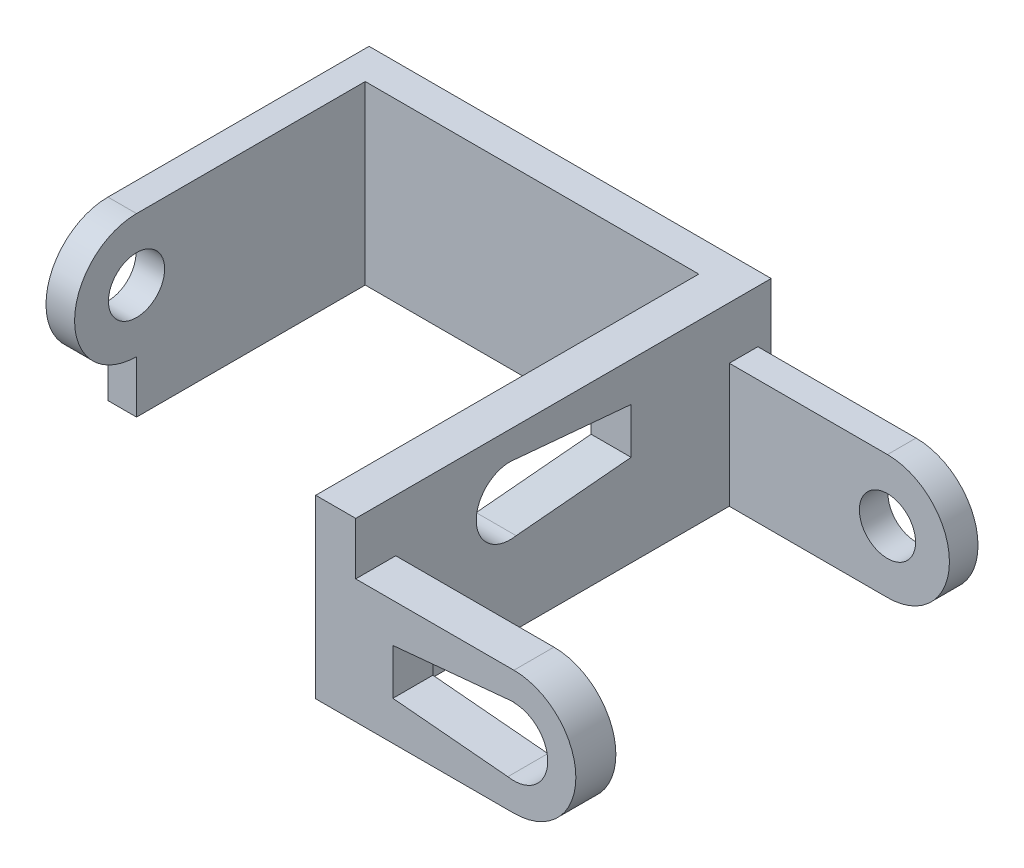
ISO-10303-21;
HEADER;
FILE_DESCRIPTION(('STEP AP214'),'2;1');
FILE_NAME('part.step','',(''),(''),'','','');
FILE_SCHEMA(('AUTOMOTIVE_DESIGN { 1 0 10303 214 1 1 1 1 }'));
ENDSEC;
DATA;
#1=APPLICATION_CONTEXT('core data for automotive mechanical design processes');
#2=APPLICATION_PROTOCOL_DEFINITION('international standard','automotive_design',2000,#1);
#3=PRODUCT_CONTEXT('',#1,'mechanical');
#4=PRODUCT('Part','Part','',(#3));
#5=PRODUCT_RELATED_PRODUCT_CATEGORY('part','',(#4));
#6=PRODUCT_DEFINITION_FORMATION('','',#4);
#7=PRODUCT_DEFINITION_CONTEXT('part definition',#1,'design');
#8=PRODUCT_DEFINITION('design','',#6,#7);
#9=PRODUCT_DEFINITION_SHAPE('','',#8);
#10=(LENGTH_UNIT() NAMED_UNIT(*) SI_UNIT(.MILLI.,.METRE.));
#11=(NAMED_UNIT(*) PLANE_ANGLE_UNIT() SI_UNIT($,.RADIAN.));
#12=(NAMED_UNIT(*) SI_UNIT($,.STERADIAN.) SOLID_ANGLE_UNIT());
#13=UNCERTAINTY_MEASURE_WITH_UNIT(LENGTH_MEASURE(1.E-05),#10,'distance_accuracy_value','');
#14=(GEOMETRIC_REPRESENTATION_CONTEXT(3) GLOBAL_UNCERTAINTY_ASSIGNED_CONTEXT((#13)) GLOBAL_UNIT_ASSIGNED_CONTEXT((#10,
#11,#12)) REPRESENTATION_CONTEXT('',''));
#15=CARTESIAN_POINT('',(0.,0.,0.));
#16=DIRECTION('',(0.,0.,1.));
#17=DIRECTION('',(1.,0.,0.));
#18=AXIS2_PLACEMENT_3D('',#15,#16,#17);
#19=CARTESIAN_POINT('',(-72.,12.,0.));
#20=DIRECTION('',(0.,0.,-1.));
#21=DIRECTION('',(-1.,0.,0.));
#22=AXIS2_PLACEMENT_3D('',#19,#20,#21);
#23=PLANE('',#22);
#24=DIRECTION('',(-1.,0.,0.));
#25=VECTOR('',#24,1.);
#26=CARTESIAN_POINT('',(-72.,17.5,0.));
#27=LINE('',#26,#25);
#28=CARTESIAN_POINT('',(-75.,17.5,0.));
#29=VERTEX_POINT('',#28);
#30=CARTESIAN_POINT('',(-72.,17.5,0.));
#31=VERTEX_POINT('',#30);
#32=EDGE_CURVE('E11',#29,#31,#27,.F.);
#33=ORIENTED_EDGE('',*,*,#32,.F.);
#34=DIRECTION('',(0.,-1.,0.));
#35=VECTOR('',#34,1.);
#36=CARTESIAN_POINT('',(-75.,12.,0.));
#37=LINE('',#36,#35);
#38=CARTESIAN_POINT('',(-75.,12.,0.));
#39=VERTEX_POINT('',#38);
#40=EDGE_CURVE('E206',#29,#39,#37,.T.);
#41=ORIENTED_EDGE('',*,*,#40,.T.);
#42=DIRECTION('',(-1.,0.,0.));
#43=VECTOR('',#42,1.);
#44=CARTESIAN_POINT('',(-72.,12.,0.));
#45=LINE('',#44,#43);
#46=CARTESIAN_POINT('',(-72.,12.,0.));
#47=VERTEX_POINT('',#46);
#48=EDGE_CURVE('E247',#47,#39,#45,.T.);
#49=ORIENTED_EDGE('',*,*,#48,.F.);
#50=DIRECTION('',(0.,-1.,0.));
#51=VECTOR('',#50,1.);
#52=CARTESIAN_POINT('',(-72.,12.,0.));
#53=LINE('',#52,#51);
#54=EDGE_CURVE('E55',#31,#47,#53,.T.);
#55=ORIENTED_EDGE('',*,*,#54,.F.);
#56=EDGE_LOOP('',(#33,#41,#49,#55));
#57=FACE_BOUND('',#56,.T.);
#58=ADVANCED_FACE('F39',(#57),#23,.F.);
#59=CARTESIAN_POINT('',(0.,0.,-24.));
#60=DIRECTION('',(0.,0.,-1.));
#61=DIRECTION('',(-1.,0.,0.));
#62=AXIS2_PLACEMENT_3D('',#59,#60,#61);
#63=PLANE('',#62);
#64=DIRECTION('',(0.,1.,0.));
#65=VECTOR('',#64,1.);
#66=CARTESIAN_POINT('',(-72.,0.,-24.));
#67=LINE('',#66,#65);
#68=CARTESIAN_POINT('',(-72.,12.,-24.));
#69=VERTEX_POINT('',#68);
#70=CARTESIAN_POINT('',(-72.,30.5,-24.));
#71=VERTEX_POINT('',#70);
#72=EDGE_CURVE('E48',#69,#71,#67,.T.);
#73=ORIENTED_EDGE('',*,*,#72,.F.);
#74=DIRECTION('',(1.,0.,0.));
#75=VECTOR('',#74,1.);
#76=CARTESIAN_POINT('',(-75.,12.,-24.));
#77=LINE('',#76,#75);
#78=CARTESIAN_POINT('',(-37.,12.,-24.));
#79=VERTEX_POINT('',#78);
#80=EDGE_CURVE('E251',#69,#79,#77,.T.);
#81=ORIENTED_EDGE('',*,*,#80,.T.);
#82=DIRECTION('',(0.,-1.,0.));
#83=VECTOR('',#82,1.);
#84=CARTESIAN_POINT('',(-37.,0.,-24.));
#85=LINE('',#84,#83);
#86=CARTESIAN_POINT('',(-37.,30.5,-24.));
#87=VERTEX_POINT('',#86);
#88=EDGE_CURVE('E482',#87,#79,#85,.T.);
#89=ORIENTED_EDGE('',*,*,#88,.F.);
#90=DIRECTION('',(-1.,0.,0.));
#91=VECTOR('',#90,1.);
#92=CARTESIAN_POINT('',(-75.,30.5,-24.));
#93=LINE('',#92,#91);
#94=EDGE_CURVE('E254',#87,#71,#93,.T.);
#95=ORIENTED_EDGE('',*,*,#94,.T.);
#96=EDGE_LOOP('',(#73,#81,#89,#95));
#97=FACE_BOUND('',#96,.T.);
#98=ADVANCED_FACE('F497',(#97),#63,.F.);
#99=CARTESIAN_POINT('',(-37.,0.,0.));
#100=DIRECTION('',(-1.,0.,0.));
#101=DIRECTION('',(0.,0.,1.));
#102=AXIS2_PLACEMENT_3D('',#99,#100,#101);
#103=PLANE('',#102);
#104=DIRECTION('',(0.,0.0899269689956985,0.995948362239352));
#105=VECTOR('',#104,1.);
#106=CARTESIAN_POINT('',(-37.,26.4032814053959,-12.7));
#107=LINE('',#106,#105);
#108=CARTESIAN_POINT('',(-37.,26.4032814053959,-12.7));
#109=VERTEX_POINT('',#108);
#110=CARTESIAN_POINT('',(-37.,27.4925832957555,-0.635894584196137));
#111=VERTEX_POINT('',#110);
#112=EDGE_CURVE('E402',#109,#111,#107,.T.);
#113=ORIENTED_EDGE('',*,*,#112,.T.);
#114=CARTESIAN_POINT('',(-37.,24.,0.));
#115=DIRECTION('',(1.,0.,0.));
#116=DIRECTION('',(0.,0.,-1.));
#117=AXIS2_PLACEMENT_3D('',#114,#115,#116);
#118=CIRCLE('',#117,3.55);
#119=CARTESIAN_POINT('',(-37.,20.5074167042445,-0.635894584196137));
#120=VERTEX_POINT('',#119);
#121=EDGE_CURVE('E422',#111,#120,#118,.T.);
#122=ORIENTED_EDGE('',*,*,#121,.T.);
#123=DIRECTION('',(0.,0.0899269689956985,-0.995948362239352));
#124=VECTOR('',#123,1.);
#125=CARTESIAN_POINT('',(-37.,20.45,0.));
#126=LINE('',#125,#124);
#127=CARTESIAN_POINT('',(-37.,21.5967185946041,-12.7));
#128=VERTEX_POINT('',#127);
#129=EDGE_CURVE('E393',#120,#128,#126,.T.);
#130=ORIENTED_EDGE('',*,*,#129,.T.);
#131=DIRECTION('',(0.,1.,0.));
#132=VECTOR('',#131,1.);
#133=CARTESIAN_POINT('',(-37.,21.5967185946041,-12.7));
#134=LINE('',#133,#132);
#135=EDGE_CURVE('E397',#128,#109,#134,.T.);
#136=ORIENTED_EDGE('',*,*,#135,.T.);
#137=EDGE_LOOP('',(#113,#122,#130,#136));
#138=FACE_BOUND('',#137,.T.);
#139=DIRECTION('',(0.,0.,1.));
#140=VECTOR('',#139,1.);
#141=CARTESIAN_POINT('',(-37.,30.5,16.2));
#142=LINE('',#141,#140);
#143=CARTESIAN_POINT('',(-37.,30.5,16.2));
#144=VERTEX_POINT('',#143);
#145=EDGE_CURVE('E433',#87,#144,#142,.T.);
#146=ORIENTED_EDGE('',*,*,#145,.F.);
#147=ORIENTED_EDGE('',*,*,#88,.T.);
#148=DIRECTION('',(0.,0.,-1.));
#149=VECTOR('',#148,1.);
#150=CARTESIAN_POINT('',(-37.,12.,16.2));
#151=LINE('',#150,#149);
#152=CARTESIAN_POINT('',(-37.,12.,16.2));
#153=VERTEX_POINT('',#152);
#154=EDGE_CURVE('E447',#153,#79,#151,.T.);
#155=ORIENTED_EDGE('',*,*,#154,.F.);
#156=DIRECTION('',(0.,-1.,0.));
#157=VECTOR('',#156,1.);
#158=CARTESIAN_POINT('',(-37.,12.,16.2));
#159=LINE('',#158,#157);
#160=EDGE_CURVE('E425',#144,#153,#159,.T.);
#161=ORIENTED_EDGE('',*,*,#160,.F.);
#162=EDGE_LOOP('',(#146,#147,#155,#161));
#163=FACE_BOUND('',#162,.T.);
#164=ADVANCED_FACE('F499',(#138,#163),#103,.T.);
#165=CARTESIAN_POINT('',(-32.8,0.,0.));
#166=DIRECTION('',(-1.,0.,0.));
#167=DIRECTION('',(0.,0.,1.));
#168=AXIS2_PLACEMENT_3D('',#165,#166,#167);
#169=PLANE('',#168);
#170=DIRECTION('',(0.,0.,1.));
#171=VECTOR('',#170,1.);
#172=CARTESIAN_POINT('',(-32.8,30.5,16.2));
#173=LINE('',#172,#171);
#174=CARTESIAN_POINT('',(-32.8,30.5,-27.4));
#175=VERTEX_POINT('',#174);
#176=CARTESIAN_POINT('',(-32.8,30.5,16.2));
#177=VERTEX_POINT('',#176);
#178=EDGE_CURVE('E441',#175,#177,#173,.T.);
#179=ORIENTED_EDGE('',*,*,#178,.T.);
#180=DIRECTION('',(0.,-1.,0.));
#181=VECTOR('',#180,1.);
#182=CARTESIAN_POINT('',(-32.8,12.,16.2));
#183=LINE('',#182,#181);
#184=CARTESIAN_POINT('',(-32.8,25.,16.2));
#185=VERTEX_POINT('',#184);
#186=EDGE_CURVE('E428',#177,#185,#183,.T.);
#187=ORIENTED_EDGE('',*,*,#186,.T.);
#188=DIRECTION('',(0.,0.,1.));
#189=VECTOR('',#188,1.);
#190=CARTESIAN_POINT('',(-32.8,25.,0.));
#191=LINE('',#190,#189);
#192=CARTESIAN_POINT('',(-32.8,25.,12.));
#193=VERTEX_POINT('',#192);
#194=EDGE_CURVE('E389',#193,#185,#191,.T.);
#195=ORIENTED_EDGE('',*,*,#194,.F.);
#196=DIRECTION('',(0.,-1.,0.));
#197=VECTOR('',#196,1.);
#198=CARTESIAN_POINT('',(-32.8,0.,12.));
#199=LINE('',#198,#197);
#200=CARTESIAN_POINT('',(-32.8,12.,12.));
#201=VERTEX_POINT('',#200);
#202=EDGE_CURVE('E385',#193,#201,#199,.T.);
#203=ORIENTED_EDGE('',*,*,#202,.T.);
#204=DIRECTION('',(0.,0.,-1.));
#205=VECTOR('',#204,1.);
#206=CARTESIAN_POINT('',(-32.8,12.,16.2));
#207=LINE('',#206,#205);
#208=CARTESIAN_POINT('',(-32.8,12.,-23.));
#209=VERTEX_POINT('',#208);
#210=EDGE_CURVE('E434',#201,#209,#207,.T.);
#211=ORIENTED_EDGE('',*,*,#210,.T.);
#212=DIRECTION('',(0.,-1.,0.));
#213=VECTOR('',#212,1.);
#214=CARTESIAN_POINT('',(-32.8,0.,-23.));
#215=LINE('',#214,#213);
#216=CARTESIAN_POINT('',(-32.8,25.,-23.));
#217=VERTEX_POINT('',#216);
#218=EDGE_CURVE('E306',#217,#209,#215,.T.);
#219=ORIENTED_EDGE('',*,*,#218,.F.);
#220=DIRECTION('',(0.,0.,1.));
#221=VECTOR('',#220,1.);
#222=CARTESIAN_POINT('',(-32.8,25.,0.));
#223=LINE('',#222,#221);
#224=CARTESIAN_POINT('',(-32.8,25.,-26.));
#225=VERTEX_POINT('',#224);
#226=EDGE_CURVE('E309',#225,#217,#223,.T.);
#227=ORIENTED_EDGE('',*,*,#226,.F.);
#228=DIRECTION('',(0.,-1.,0.));
#229=VECTOR('',#228,1.);
#230=CARTESIAN_POINT('',(-32.8,0.,-26.));
#231=LINE('',#230,#229);
#232=CARTESIAN_POINT('',(-32.8,12.,-26.));
#233=VERTEX_POINT('',#232);
#234=EDGE_CURVE('E302',#225,#233,#231,.T.);
#235=ORIENTED_EDGE('',*,*,#234,.T.);
#236=CARTESIAN_POINT('',(-32.8,12.,-27.4));
#237=VERTEX_POINT('',#236);
#238=EDGE_CURVE('E432',#233,#237,#207,.T.);
#239=ORIENTED_EDGE('',*,*,#238,.T.);
#240=DIRECTION('',(0.,1.,0.));
#241=VECTOR('',#240,1.);
#242=CARTESIAN_POINT('',(-32.8,12.,-27.4));
#243=LINE('',#242,#241);
#244=EDGE_CURVE('E438',#237,#175,#243,.T.);
#245=ORIENTED_EDGE('',*,*,#244,.T.);
#246=EDGE_LOOP('',(#179,#187,#195,#203,#211,#219,#227,#235,#239,#245));
#247=FACE_BOUND('',#246,.T.);
#248=CARTESIAN_POINT('',(-32.8,24.,0.));
#249=DIRECTION('',(1.,0.,0.));
#250=DIRECTION('',(0.,0.,-1.));
#251=AXIS2_PLACEMENT_3D('',#248,#249,#250);
#252=CIRCLE('',#251,3.55);
#253=CARTESIAN_POINT('',(-32.8,27.4925832957555,-0.635894584196137));
#254=VERTEX_POINT('',#253);
#255=CARTESIAN_POINT('',(-32.8,20.5074167042445,-0.635894584196137));
#256=VERTEX_POINT('',#255);
#257=EDGE_CURVE('E418',#254,#256,#252,.T.);
#258=ORIENTED_EDGE('',*,*,#257,.F.);
#259=DIRECTION('',(0.,0.0899269689956985,0.995948362239352));
#260=VECTOR('',#259,1.);
#261=CARTESIAN_POINT('',(-32.8,26.4032814053959,-12.7));
#262=LINE('',#261,#260);
#263=CARTESIAN_POINT('',(-32.8,26.4032814053959,-12.7));
#264=VERTEX_POINT('',#263);
#265=EDGE_CURVE('E398',#264,#254,#262,.T.);
#266=ORIENTED_EDGE('',*,*,#265,.F.);
#267=DIRECTION('',(0.,1.,0.));
#268=VECTOR('',#267,1.);
#269=CARTESIAN_POINT('',(-32.8,21.5967185946041,-12.7));
#270=LINE('',#269,#268);
#271=CARTESIAN_POINT('',(-32.8,21.5967185946041,-12.7));
#272=VERTEX_POINT('',#271);
#273=EDGE_CURVE('E409',#272,#264,#270,.T.);
#274=ORIENTED_EDGE('',*,*,#273,.F.);
#275=DIRECTION('',(0.,0.0899269689956985,-0.995948362239352));
#276=VECTOR('',#275,1.);
#277=CARTESIAN_POINT('',(-32.8,20.45,0.));
#278=LINE('',#277,#276);
#279=EDGE_CURVE('E392',#256,#272,#278,.T.);
#280=ORIENTED_EDGE('',*,*,#279,.F.);
#281=EDGE_LOOP('',(#258,#266,#274,#280));
#282=FACE_BOUND('',#281,.T.);
#283=ADVANCED_FACE('F507',(#247,#282),#169,.F.);
#284=CARTESIAN_POINT('',(-32.8,12.,16.2));
#285=DIRECTION('',(0.,0.,-1.));
#286=DIRECTION('',(-1.,0.,0.));
#287=AXIS2_PLACEMENT_3D('',#284,#285,#286);
#288=PLANE('',#287);
#289=DIRECTION('',(-0.99556196460308,-0.0941083133185142,0.));
#290=VECTOR('',#289,1.);
#291=CARTESIAN_POINT('',(-16.2,22.1037848613728,16.2));
#292=LINE('',#291,#290);
#293=CARTESIAN_POINT('',(-16.2,22.1037848613728,16.2));
#294=VERTEX_POINT('',#293);
#295=CARTESIAN_POINT('',(-28.9,20.9032814053959,16.2));
#296=VERTEX_POINT('',#295);
#297=EDGE_CURVE('E333',#294,#296,#292,.T.);
#298=ORIENTED_EDGE('',*,*,#297,.F.);
#299=DIRECTION('',(0.,1.,0.));
#300=VECTOR('',#299,1.);
#301=CARTESIAN_POINT('',(-16.2,14.95,16.2));
#302=LINE('',#301,#300);
#303=CARTESIAN_POINT('',(-16.2,22.05,16.2));
#304=VERTEX_POINT('',#303);
#305=EDGE_CURVE('E312',#304,#294,#302,.T.);
#306=ORIENTED_EDGE('',*,*,#305,.F.);
#307=CARTESIAN_POINT('',(-16.2,18.5,16.2));
#308=DIRECTION('',(0.,0.,1.));
#309=DIRECTION('',(1.,0.,0.));
#310=AXIS2_PLACEMENT_3D('',#307,#308,#309);
#311=CIRCLE('',#310,3.55);
#312=CARTESIAN_POINT('',(-16.8358945841961,15.0074167042445,16.2));
#313=VERTEX_POINT('',#312);
#314=EDGE_CURVE('E346',#313,#304,#311,.T.);
#315=ORIENTED_EDGE('',*,*,#314,.F.);
#316=DIRECTION('',(0.995948362239352,-0.0899269689956984,0.));
#317=VECTOR('',#316,1.);
#318=CARTESIAN_POINT('',(-28.9,16.0967185946041,16.2));
#319=LINE('',#318,#317);
#320=CARTESIAN_POINT('',(-28.9,16.0967185946041,16.2));
#321=VERTEX_POINT('',#320);
#322=EDGE_CURVE('E318',#321,#313,#319,.T.);
#323=ORIENTED_EDGE('',*,*,#322,.F.);
#324=DIRECTION('',(0.,-1.,0.));
#325=VECTOR('',#324,1.);
#326=CARTESIAN_POINT('',(-28.9,20.9032814053959,16.2));
#327=LINE('',#326,#325);
#328=EDGE_CURVE('E337',#296,#321,#327,.T.);
#329=ORIENTED_EDGE('',*,*,#328,.F.);
#330=EDGE_LOOP('',(#298,#306,#315,#323,#329));
#331=FACE_BOUND('',#330,.T.);
#332=DIRECTION('',(-1.,0.,0.));
#333=VECTOR('',#332,1.);
#334=CARTESIAN_POINT('',(-32.8,12.,16.2));
#335=LINE('',#334,#333);
#336=CARTESIAN_POINT('',(-16.2,12.,16.2));
#337=VERTEX_POINT('',#336);
#338=EDGE_CURVE('E462',#337,#153,#335,.T.);
#339=ORIENTED_EDGE('',*,*,#338,.F.);
#340=CARTESIAN_POINT('',(-16.2,18.5,16.2));
#341=DIRECTION('',(0.,0.,1.));
#342=DIRECTION('',(1.,0.,0.));
#343=AXIS2_PLACEMENT_3D('',#340,#341,#342);
#344=CIRCLE('',#343,6.5);
#345=CARTESIAN_POINT('',(-16.2,25.,16.2));
#346=VERTEX_POINT('',#345);
#347=EDGE_CURVE('E359',#337,#346,#344,.T.);
#348=ORIENTED_EDGE('',*,*,#347,.T.);
#349=DIRECTION('',(-1.,0.,0.));
#350=VECTOR('',#349,1.);
#351=CARTESIAN_POINT('',(-37.,25.,16.2));
#352=LINE('',#351,#350);
#353=EDGE_CURVE('E367',#346,#185,#352,.T.);
#354=ORIENTED_EDGE('',*,*,#353,.T.);
#355=ORIENTED_EDGE('',*,*,#186,.F.);
#356=DIRECTION('',(-1.,0.,0.));
#357=VECTOR('',#356,1.);
#358=CARTESIAN_POINT('',(-32.8,30.5,16.2));
#359=LINE('',#358,#357);
#360=EDGE_CURVE('E444',#177,#144,#359,.T.);
#361=ORIENTED_EDGE('',*,*,#360,.T.);
#362=ORIENTED_EDGE('',*,*,#160,.T.);
#363=EDGE_LOOP('',(#339,#348,#354,#355,#361,#362));
#364=FACE_BOUND('',#363,.T.);
#365=ADVANCED_FACE('F41',(#331,#364),#288,.F.);
#366=CARTESIAN_POINT('',(-32.8,12.,16.2));
#367=DIRECTION('',(0.,1.,0.));
#368=DIRECTION('',(0.,0.,1.));
#369=AXIS2_PLACEMENT_3D('',#366,#367,#368);
#370=PLANE('',#369);
#371=DIRECTION('',(0.,0.,-1.));
#372=VECTOR('',#371,1.);
#373=CARTESIAN_POINT('',(-75.,12.,-24.));
#374=LINE('',#373,#372);
#375=CARTESIAN_POINT('',(-75.,12.,-27.4));
#376=VERTEX_POINT('',#375);
#377=EDGE_CURVE('E213',#39,#376,#374,.T.);
#378=ORIENTED_EDGE('',*,*,#377,.T.);
#379=DIRECTION('',(-1.,0.,0.));
#380=VECTOR('',#379,1.);
#381=CARTESIAN_POINT('',(-32.8,12.,-27.4));
#382=LINE('',#381,#380);
#383=EDGE_CURVE('E459',#237,#376,#382,.T.);
#384=ORIENTED_EDGE('',*,*,#383,.F.);
#385=ORIENTED_EDGE('',*,*,#238,.F.);
#386=DIRECTION('',(1.,0.,0.));
#387=VECTOR('',#386,1.);
#388=CARTESIAN_POINT('',(-37.,12.,-26.));
#389=LINE('',#388,#387);
#390=CARTESIAN_POINT('',(-16.2,12.,-26.));
#391=VERTEX_POINT('',#390);
#392=EDGE_CURVE('E277',#233,#391,#389,.T.);
#393=ORIENTED_EDGE('',*,*,#392,.T.);
#394=DIRECTION('',(0.,0.,-1.));
#395=VECTOR('',#394,1.);
#396=CARTESIAN_POINT('',(-16.2,12.,-23.));
#397=LINE('',#396,#395);
#398=CARTESIAN_POINT('',(-16.2,12.,-23.));
#399=VERTEX_POINT('',#398);
#400=EDGE_CURVE('E298',#399,#391,#397,.T.);
#401=ORIENTED_EDGE('',*,*,#400,.F.);
#402=DIRECTION('',(1.,0.,0.));
#403=VECTOR('',#402,1.);
#404=CARTESIAN_POINT('',(-37.,12.,-23.));
#405=LINE('',#404,#403);
#406=EDGE_CURVE('E281',#209,#399,#405,.T.);
#407=ORIENTED_EDGE('',*,*,#406,.F.);
#408=ORIENTED_EDGE('',*,*,#210,.F.);
#409=DIRECTION('',(1.,0.,0.));
#410=VECTOR('',#409,1.);
#411=CARTESIAN_POINT('',(-37.,12.,12.));
#412=LINE('',#411,#410);
#413=CARTESIAN_POINT('',(-16.2,12.,12.));
#414=VERTEX_POINT('',#413);
#415=EDGE_CURVE('E363',#201,#414,#412,.T.);
#416=ORIENTED_EDGE('',*,*,#415,.T.);
#417=DIRECTION('',(0.,0.,-1.));
#418=VECTOR('',#417,1.);
#419=CARTESIAN_POINT('',(-16.2,12.,16.2));
#420=LINE('',#419,#418);
#421=EDGE_CURVE('E381',#337,#414,#420,.T.);
#422=ORIENTED_EDGE('',*,*,#421,.F.);
#423=ORIENTED_EDGE('',*,*,#338,.T.);
#424=ORIENTED_EDGE('',*,*,#154,.T.);
#425=ORIENTED_EDGE('',*,*,#80,.F.);
#426=DIRECTION('',(0.,0.,-1.));
#427=VECTOR('',#426,1.);
#428=CARTESIAN_POINT('',(-72.,12.,0.));
#429=LINE('',#428,#427);
#430=EDGE_CURVE('E238',#47,#69,#429,.T.);
#431=ORIENTED_EDGE('',*,*,#430,.F.);
#432=ORIENTED_EDGE('',*,*,#48,.T.);
#433=EDGE_LOOP('',(#378,#384,#385,#393,#401,#407,#408,#416,#422,#423,#424,#425,#431,#432));
#434=FACE_BOUND('',#433,.T.);
#435=ADVANCED_FACE('F495',(#434),#370,.F.);
#436=CARTESIAN_POINT('',(-32.8,12.,-27.4));
#437=DIRECTION('',(0.,0.,1.));
#438=DIRECTION('',(1.,0.,0.));
#439=AXIS2_PLACEMENT_3D('',#436,#437,#438);
#440=PLANE('',#439);
#441=DIRECTION('',(0.,-1.,0.));
#442=VECTOR('',#441,1.);
#443=CARTESIAN_POINT('',(-75.,12.,-27.4));
#444=LINE('',#443,#442);
#445=CARTESIAN_POINT('',(-75.,30.5,-27.4));
#446=VERTEX_POINT('',#445);
#447=EDGE_CURVE('E250',#446,#376,#444,.T.);
#448=ORIENTED_EDGE('',*,*,#447,.F.);
#449=DIRECTION('',(-1.,0.,0.));
#450=VECTOR('',#449,1.);
#451=CARTESIAN_POINT('',(-32.8,30.5,-27.4));
#452=LINE('',#451,#450);
#453=EDGE_CURVE('E456',#175,#446,#452,.T.);
#454=ORIENTED_EDGE('',*,*,#453,.F.);
#455=ORIENTED_EDGE('',*,*,#244,.F.);
#456=ORIENTED_EDGE('',*,*,#383,.T.);
#457=EDGE_LOOP('',(#448,#454,#455,#456));
#458=FACE_BOUND('',#457,.T.);
#459=ADVANCED_FACE('F513',(#458),#440,.F.);
#460=CARTESIAN_POINT('',(-32.8,30.5,16.2));
#461=DIRECTION('',(0.,-1.,0.));
#462=DIRECTION('',(0.,0.,-1.));
#463=AXIS2_PLACEMENT_3D('',#460,#461,#462);
#464=PLANE('',#463);
#465=DIRECTION('',(0.,0.,-1.));
#466=VECTOR('',#465,1.);
#467=CARTESIAN_POINT('',(-75.,30.5,-24.));
#468=LINE('',#467,#466);
#469=CARTESIAN_POINT('',(-75.,30.5,0.));
#470=VERTEX_POINT('',#469);
#471=EDGE_CURVE('E257',#470,#446,#468,.T.);
#472=ORIENTED_EDGE('',*,*,#471,.F.);
#473=DIRECTION('',(-1.,0.,0.));
#474=VECTOR('',#473,1.);
#475=CARTESIAN_POINT('',(-72.,30.5,0.));
#476=LINE('',#475,#474);
#477=CARTESIAN_POINT('',(-72.,30.5,0.));
#478=VERTEX_POINT('',#477);
#479=EDGE_CURVE('E224',#478,#470,#476,.T.);
#480=ORIENTED_EDGE('',*,*,#479,.F.);
#481=DIRECTION('',(0.,0.,1.));
#482=VECTOR('',#481,1.);
#483=CARTESIAN_POINT('',(-72.,30.5,0.));
#484=LINE('',#483,#482);
#485=EDGE_CURVE('E242',#71,#478,#484,.T.);
#486=ORIENTED_EDGE('',*,*,#485,.F.);
#487=ORIENTED_EDGE('',*,*,#94,.F.);
#488=ORIENTED_EDGE('',*,*,#145,.T.);
#489=ORIENTED_EDGE('',*,*,#360,.F.);
#490=ORIENTED_EDGE('',*,*,#178,.F.);
#491=ORIENTED_EDGE('',*,*,#453,.T.);
#492=EDGE_LOOP('',(#472,#480,#486,#487,#488,#489,#490,#491));
#493=FACE_BOUND('',#492,.T.);
#494=ADVANCED_FACE('F492',(#493),#464,.F.);
#495=CARTESIAN_POINT('',(-37.,24.,0.));
#496=DIRECTION('',(1.,0.,0.));
#497=DIRECTION('',(0.,0.,-1.));
#498=AXIS2_PLACEMENT_3D('',#495,#496,#497);
#499=CYLINDRICAL_SURFACE('',#498,3.55);
#500=ORIENTED_EDGE('',*,*,#257,.T.);
#501=DIRECTION('',(1.,0.,0.));
#502=VECTOR('',#501,1.);
#503=CARTESIAN_POINT('',(-37.,20.5074167042445,-0.635894584196137));
#504=LINE('',#503,#502);
#505=EDGE_CURVE('E466',#256,#120,#504,.F.);
#506=ORIENTED_EDGE('',*,*,#505,.T.);
#507=ORIENTED_EDGE('',*,*,#121,.F.);
#508=DIRECTION('',(1.,0.,0.));
#509=VECTOR('',#508,1.);
#510=CARTESIAN_POINT('',(-37.,27.4925832957555,-0.635894584196137));
#511=LINE('',#510,#509);
#512=EDGE_CURVE('E470',#111,#254,#511,.T.);
#513=ORIENTED_EDGE('',*,*,#512,.T.);
#514=EDGE_LOOP('',(#500,#506,#507,#513));
#515=FACE_BOUND('',#514,.T.);
#516=ADVANCED_FACE('F621',(#515),#499,.F.);
#517=CARTESIAN_POINT('',(-37.,26.4032814053959,-12.7));
#518=DIRECTION('',(0.,0.995948362239351,-0.0899269689956985));
#519=DIRECTION('',(0.,0.0899269689956985,0.995948362239352));
#520=AXIS2_PLACEMENT_3D('',#517,#518,#519);
#521=PLANE('',#520);
#522=ORIENTED_EDGE('',*,*,#112,.F.);
#523=DIRECTION('',(1.,0.,0.));
#524=VECTOR('',#523,1.);
#525=CARTESIAN_POINT('',(-37.,26.4032814053959,-12.7));
#526=LINE('',#525,#524);
#527=EDGE_CURVE('E415',#109,#264,#526,.T.);
#528=ORIENTED_EDGE('',*,*,#527,.T.);
#529=ORIENTED_EDGE('',*,*,#265,.T.);
#530=ORIENTED_EDGE('',*,*,#512,.F.);
#531=EDGE_LOOP('',(#522,#528,#529,#530));
#532=FACE_BOUND('',#531,.T.);
#533=ADVANCED_FACE('F642',(#532),#521,.F.);
#534=CARTESIAN_POINT('',(-37.,20.45,0.));
#535=DIRECTION('',(0.,-0.995948362239351,-0.0899269689956985));
#536=DIRECTION('',(0.,0.0899269689956985,-0.995948362239352));
#537=AXIS2_PLACEMENT_3D('',#534,#535,#536);
#538=PLANE('',#537);
#539=ORIENTED_EDGE('',*,*,#279,.T.);
#540=DIRECTION('',(1.,0.,0.));
#541=VECTOR('',#540,1.);
#542=CARTESIAN_POINT('',(-37.,21.5967185946041,-12.7));
#543=LINE('',#542,#541);
#544=EDGE_CURVE('E406',#128,#272,#543,.T.);
#545=ORIENTED_EDGE('',*,*,#544,.F.);
#546=ORIENTED_EDGE('',*,*,#129,.F.);
#547=ORIENTED_EDGE('',*,*,#505,.F.);
#548=EDGE_LOOP('',(#539,#545,#546,#547));
#549=FACE_BOUND('',#548,.T.);
#550=ADVANCED_FACE('F649',(#549),#538,.F.);
#551=CARTESIAN_POINT('',(-37.,21.5967185946041,-12.7));
#552=DIRECTION('',(0.,0.,-1.));
#553=DIRECTION('',(-1.,0.,0.));
#554=AXIS2_PLACEMENT_3D('',#551,#552,#553);
#555=PLANE('',#554);
#556=ORIENTED_EDGE('',*,*,#273,.T.);
#557=ORIENTED_EDGE('',*,*,#527,.F.);
#558=ORIENTED_EDGE('',*,*,#135,.F.);
#559=ORIENTED_EDGE('',*,*,#544,.T.);
#560=EDGE_LOOP('',(#556,#557,#558,#559));
#561=FACE_BOUND('',#560,.T.);
#562=ADVANCED_FACE('F657',(#561),#555,.F.);
#563=CARTESIAN_POINT('',(-37.,25.,16.2));
#564=DIRECTION('',(0.,-1.,0.));
#565=DIRECTION('',(0.,0.,-1.));
#566=AXIS2_PLACEMENT_3D('',#563,#564,#565);
#567=PLANE('',#566);
#568=DIRECTION('',(-1.,0.,0.));
#569=VECTOR('',#568,1.);
#570=CARTESIAN_POINT('',(-37.,25.,12.));
#571=LINE('',#570,#569);
#572=CARTESIAN_POINT('',(-16.2,25.,12.));
#573=VERTEX_POINT('',#572);
#574=EDGE_CURVE('E372',#573,#193,#571,.T.);
#575=ORIENTED_EDGE('',*,*,#574,.T.);
#576=ORIENTED_EDGE('',*,*,#194,.T.);
#577=ORIENTED_EDGE('',*,*,#353,.F.);
#578=DIRECTION('',(0.,0.,-1.));
#579=VECTOR('',#578,1.);
#580=CARTESIAN_POINT('',(-16.2,25.,16.2));
#581=LINE('',#580,#579);
#582=EDGE_CURVE('E371',#346,#573,#581,.T.);
#583=ORIENTED_EDGE('',*,*,#582,.T.);
#584=EDGE_LOOP('',(#575,#576,#577,#583));
#585=FACE_BOUND('',#584,.T.);
#586=ADVANCED_FACE('F536',(#585),#567,.F.);
#587=CARTESIAN_POINT('',(0.,0.,12.));
#588=DIRECTION('',(0.,0.,-1.));
#589=DIRECTION('',(-1.,0.,0.));
#590=AXIS2_PLACEMENT_3D('',#587,#588,#589);
#591=PLANE('',#590);
#592=DIRECTION('',(0.,1.,0.));
#593=VECTOR('',#592,1.);
#594=CARTESIAN_POINT('',(-16.2,14.95,12.));
#595=LINE('',#594,#593);
#596=CARTESIAN_POINT('',(-16.2,22.05,12.));
#597=VERTEX_POINT('',#596);
#598=CARTESIAN_POINT('',(-16.2,22.1037848613728,12.));
#599=VERTEX_POINT('',#598);
#600=EDGE_CURVE('E313',#597,#599,#595,.T.);
#601=ORIENTED_EDGE('',*,*,#600,.T.);
#602=DIRECTION('',(-0.99556196460308,-0.0941083133185142,0.));
#603=VECTOR('',#602,1.);
#604=CARTESIAN_POINT('',(-16.2,22.1037848613728,12.));
#605=LINE('',#604,#603);
#606=CARTESIAN_POINT('',(-28.9,20.9032814053959,12.));
#607=VERTEX_POINT('',#606);
#608=EDGE_CURVE('E317',#599,#607,#605,.T.);
#609=ORIENTED_EDGE('',*,*,#608,.T.);
#610=DIRECTION('',(0.,-1.,0.));
#611=VECTOR('',#610,1.);
#612=CARTESIAN_POINT('',(-28.9,20.9032814053959,12.));
#613=LINE('',#612,#611);
#614=CARTESIAN_POINT('',(-28.9,16.0967185946041,12.));
#615=VERTEX_POINT('',#614);
#616=EDGE_CURVE('E322',#607,#615,#613,.T.);
#617=ORIENTED_EDGE('',*,*,#616,.T.);
#618=DIRECTION('',(0.995948362239352,-0.0899269689956984,0.));
#619=VECTOR('',#618,1.);
#620=CARTESIAN_POINT('',(-28.9,16.0967185946041,12.));
#621=LINE('',#620,#619);
#622=CARTESIAN_POINT('',(-16.8358945841961,15.0074167042445,12.));
#623=VERTEX_POINT('',#622);
#624=EDGE_CURVE('E326',#615,#623,#621,.T.);
#625=ORIENTED_EDGE('',*,*,#624,.T.);
#626=CARTESIAN_POINT('',(-16.2,18.5,12.));
#627=DIRECTION('',(0.,0.,1.));
#628=DIRECTION('',(1.,0.,0.));
#629=AXIS2_PLACEMENT_3D('',#626,#627,#628);
#630=CIRCLE('',#629,3.55);
#631=EDGE_CURVE('E353',#623,#597,#630,.T.);
#632=ORIENTED_EDGE('',*,*,#631,.T.);
#633=EDGE_LOOP('',(#601,#609,#617,#625,#632));
#634=FACE_BOUND('',#633,.T.);
#635=ORIENTED_EDGE('',*,*,#574,.F.);
#636=CARTESIAN_POINT('',(-16.2,18.5,12.));
#637=DIRECTION('',(0.,0.,1.));
#638=DIRECTION('',(1.,0.,0.));
#639=AXIS2_PLACEMENT_3D('',#636,#637,#638);
#640=CIRCLE('',#639,6.5);
#641=EDGE_CURVE('E356',#414,#573,#640,.T.);
#642=ORIENTED_EDGE('',*,*,#641,.F.);
#643=ORIENTED_EDGE('',*,*,#415,.F.);
#644=ORIENTED_EDGE('',*,*,#202,.F.);
#645=EDGE_LOOP('',(#635,#642,#643,#644));
#646=FACE_BOUND('',#645,.T.);
#647=ADVANCED_FACE('F533',(#634,#646),#591,.T.);
#648=CARTESIAN_POINT('',(-16.2,18.5,16.2));
#649=DIRECTION('',(0.,0.,-1.));
#650=DIRECTION('',(-1.,0.,0.));
#651=AXIS2_PLACEMENT_3D('',#648,#649,#650);
#652=CYLINDRICAL_SURFACE('',#651,6.5);
#653=ORIENTED_EDGE('',*,*,#641,.T.);
#654=ORIENTED_EDGE('',*,*,#582,.F.);
#655=ORIENTED_EDGE('',*,*,#347,.F.);
#656=ORIENTED_EDGE('',*,*,#421,.T.);
#657=EDGE_LOOP('',(#653,#654,#655,#656));
#658=FACE_BOUND('',#657,.T.);
#659=ADVANCED_FACE('F540',(#658),#652,.T.);
#660=CARTESIAN_POINT('',(-16.2,18.5,12.));
#661=DIRECTION('',(0.,0.,1.));
#662=DIRECTION('',(1.,0.,0.));
#663=AXIS2_PLACEMENT_3D('',#660,#661,#662);
#664=CYLINDRICAL_SURFACE('',#663,3.55);
#665=ORIENTED_EDGE('',*,*,#314,.T.);
#666=DIRECTION('',(0.,0.,1.));
#667=VECTOR('',#666,1.);
#668=CARTESIAN_POINT('',(-16.2,22.05,12.));
#669=LINE('',#668,#667);
#670=EDGE_CURVE('E478',#304,#597,#669,.F.);
#671=ORIENTED_EDGE('',*,*,#670,.T.);
#672=ORIENTED_EDGE('',*,*,#631,.F.);
#673=DIRECTION('',(0.,0.,1.));
#674=VECTOR('',#673,1.);
#675=CARTESIAN_POINT('',(-16.8358945841962,15.0074167042446,12.));
#676=LINE('',#675,#674);
#677=EDGE_CURVE('E474',#623,#313,#676,.T.);
#678=ORIENTED_EDGE('',*,*,#677,.T.);
#679=EDGE_LOOP('',(#665,#671,#672,#678));
#680=FACE_BOUND('',#679,.T.);
#681=ADVANCED_FACE('F543',(#680),#664,.F.);
#682=CARTESIAN_POINT('',(-16.2,14.95,12.));
#683=DIRECTION('',(1.,0.,0.));
#684=DIRECTION('',(0.,0.,-1.));
#685=AXIS2_PLACEMENT_3D('',#682,#683,#684);
#686=PLANE('',#685);
#687=ORIENTED_EDGE('',*,*,#305,.T.);
#688=DIRECTION('',(0.,0.,1.));
#689=VECTOR('',#688,1.);
#690=CARTESIAN_POINT('',(-16.2,22.1037848613728,12.));
#691=LINE('',#690,#689);
#692=EDGE_CURVE('E330',#599,#294,#691,.T.);
#693=ORIENTED_EDGE('',*,*,#692,.F.);
#694=ORIENTED_EDGE('',*,*,#600,.F.);
#695=ORIENTED_EDGE('',*,*,#670,.F.);
#696=EDGE_LOOP('',(#687,#693,#694,#695));
#697=FACE_BOUND('',#696,.T.);
#698=ADVANCED_FACE('F549',(#697),#686,.F.);
#699=CARTESIAN_POINT('',(-28.9,16.0967185946041,12.));
#700=DIRECTION('',(-0.0899269689956984,-0.995948362239351,0.));
#701=DIRECTION('',(0.995948362239352,-0.0899269689956984,0.));
#702=AXIS2_PLACEMENT_3D('',#699,#700,#701);
#703=PLANE('',#702);
#704=ORIENTED_EDGE('',*,*,#624,.F.);
#705=DIRECTION('',(0.,0.,1.));
#706=VECTOR('',#705,1.);
#707=CARTESIAN_POINT('',(-28.9,16.0967185946041,12.));
#708=LINE('',#707,#706);
#709=EDGE_CURVE('E343',#615,#321,#708,.T.);
#710=ORIENTED_EDGE('',*,*,#709,.T.);
#711=ORIENTED_EDGE('',*,*,#322,.T.);
#712=ORIENTED_EDGE('',*,*,#677,.F.);
#713=EDGE_LOOP('',(#704,#710,#711,#712));
#714=FACE_BOUND('',#713,.T.);
#715=ADVANCED_FACE('F582',(#714),#703,.F.);
#716=CARTESIAN_POINT('',(-28.9,20.9032814053959,12.));
#717=DIRECTION('',(-1.,0.,0.));
#718=DIRECTION('',(0.,0.,1.));
#719=AXIS2_PLACEMENT_3D('',#716,#717,#718);
#720=PLANE('',#719);
#721=ORIENTED_EDGE('',*,*,#328,.T.);
#722=ORIENTED_EDGE('',*,*,#709,.F.);
#723=ORIENTED_EDGE('',*,*,#616,.F.);
#724=DIRECTION('',(0.,0.,1.));
#725=VECTOR('',#724,1.);
#726=CARTESIAN_POINT('',(-28.9,20.9032814053959,12.));
#727=LINE('',#726,#725);
#728=EDGE_CURVE('E347',#607,#296,#727,.T.);
#729=ORIENTED_EDGE('',*,*,#728,.T.);
#730=EDGE_LOOP('',(#721,#722,#723,#729));
#731=FACE_BOUND('',#730,.T.);
#732=ADVANCED_FACE('F585',(#731),#720,.F.);
#733=CARTESIAN_POINT('',(-16.2,22.1037848613728,12.));
#734=DIRECTION('',(-0.0941083133185142,0.99556196460308,0.));
#735=DIRECTION('',(-0.99556196460308,-0.0941083133185142,0.));
#736=AXIS2_PLACEMENT_3D('',#733,#734,#735);
#737=PLANE('',#736);
#738=ORIENTED_EDGE('',*,*,#297,.T.);
#739=ORIENTED_EDGE('',*,*,#728,.F.);
#740=ORIENTED_EDGE('',*,*,#608,.F.);
#741=ORIENTED_EDGE('',*,*,#692,.T.);
#742=EDGE_LOOP('',(#738,#739,#740,#741));
#743=FACE_BOUND('',#742,.T.);
#744=ADVANCED_FACE('F581',(#743),#737,.F.);
#745=CARTESIAN_POINT('',(-37.,25.,-23.));
#746=DIRECTION('',(0.,-1.,0.));
#747=DIRECTION('',(0.,0.,-1.));
#748=AXIS2_PLACEMENT_3D('',#745,#746,#747);
#749=PLANE('',#748);
#750=DIRECTION('',(-1.,0.,0.));
#751=VECTOR('',#750,1.);
#752=CARTESIAN_POINT('',(-37.,25.,-26.));
#753=LINE('',#752,#751);
#754=CARTESIAN_POINT('',(-16.2,25.,-26.));
#755=VERTEX_POINT('',#754);
#756=EDGE_CURVE('E285',#755,#225,#753,.T.);
#757=ORIENTED_EDGE('',*,*,#756,.T.);
#758=ORIENTED_EDGE('',*,*,#226,.T.);
#759=DIRECTION('',(-1.,0.,0.));
#760=VECTOR('',#759,1.);
#761=CARTESIAN_POINT('',(-37.,25.,-23.));
#762=LINE('',#761,#760);
#763=CARTESIAN_POINT('',(-16.2,25.,-23.));
#764=VERTEX_POINT('',#763);
#765=EDGE_CURVE('E284',#764,#217,#762,.T.);
#766=ORIENTED_EDGE('',*,*,#765,.F.);
#767=DIRECTION('',(0.,0.,-1.));
#768=VECTOR('',#767,1.);
#769=CARTESIAN_POINT('',(-16.2,25.,-23.));
#770=LINE('',#769,#768);
#771=EDGE_CURVE('E289',#764,#755,#770,.T.);
#772=ORIENTED_EDGE('',*,*,#771,.T.);
#773=EDGE_LOOP('',(#757,#758,#766,#772));
#774=FACE_BOUND('',#773,.T.);
#775=ADVANCED_FACE('F524',(#774),#749,.F.);
#776=CARTESIAN_POINT('',(0.,0.,-23.));
#777=DIRECTION('',(0.,0.,-1.));
#778=DIRECTION('',(-1.,0.,0.));
#779=AXIS2_PLACEMENT_3D('',#776,#777,#778);
#780=PLANE('',#779);
#781=CARTESIAN_POINT('',(-16.2,18.5,-23.));
#782=DIRECTION('',(0.,0.,1.));
#783=DIRECTION('',(1.,0.,0.));
#784=AXIS2_PLACEMENT_3D('',#781,#782,#783);
#785=CIRCLE('',#784,2.95);
#786=CARTESIAN_POINT('',(-13.25,18.5,-23.));
#787=VERTEX_POINT('',#786);
#788=EDGE_CURVE('E264',#787,#787,#785,.T.);
#789=ORIENTED_EDGE('',*,*,#788,.F.);
#790=EDGE_LOOP('',(#789));
#791=FACE_BOUND('',#790,.T.);
#792=ORIENTED_EDGE('',*,*,#406,.T.);
#793=CARTESIAN_POINT('',(-16.2,18.5,-23.));
#794=DIRECTION('',(0.,0.,1.));
#795=DIRECTION('',(1.,0.,0.));
#796=AXIS2_PLACEMENT_3D('',#793,#794,#795);
#797=CIRCLE('',#796,6.5);
#798=EDGE_CURVE('E273',#399,#764,#797,.T.);
#799=ORIENTED_EDGE('',*,*,#798,.T.);
#800=ORIENTED_EDGE('',*,*,#765,.T.);
#801=ORIENTED_EDGE('',*,*,#218,.T.);
#802=EDGE_LOOP('',(#792,#799,#800,#801));
#803=FACE_BOUND('',#802,.T.);
#804=ADVANCED_FACE('F572',(#791,#803),#780,.F.);
#805=CARTESIAN_POINT('',(0.,0.,-26.));
#806=DIRECTION('',(0.,0.,-1.));
#807=DIRECTION('',(-1.,0.,0.));
#808=AXIS2_PLACEMENT_3D('',#805,#806,#807);
#809=PLANE('',#808);
#810=CARTESIAN_POINT('',(-16.2,18.5,-26.));
#811=DIRECTION('',(0.,0.,1.));
#812=DIRECTION('',(1.,0.,0.));
#813=AXIS2_PLACEMENT_3D('',#810,#811,#812);
#814=CIRCLE('',#813,2.95);
#815=CARTESIAN_POINT('',(-13.25,18.5,-26.));
#816=VERTEX_POINT('',#815);
#817=EDGE_CURVE('E265',#816,#816,#814,.T.);
#818=ORIENTED_EDGE('',*,*,#817,.T.);
#819=EDGE_LOOP('',(#818));
#820=FACE_BOUND('',#819,.T.);
#821=ORIENTED_EDGE('',*,*,#756,.F.);
#822=CARTESIAN_POINT('',(-16.2,18.5,-26.));
#823=DIRECTION('',(0.,0.,1.));
#824=DIRECTION('',(1.,0.,0.));
#825=AXIS2_PLACEMENT_3D('',#822,#823,#824);
#826=CIRCLE('',#825,6.5);
#827=EDGE_CURVE('E269',#391,#755,#826,.T.);
#828=ORIENTED_EDGE('',*,*,#827,.F.);
#829=ORIENTED_EDGE('',*,*,#392,.F.);
#830=ORIENTED_EDGE('',*,*,#234,.F.);
#831=EDGE_LOOP('',(#821,#828,#829,#830));
#832=FACE_BOUND('',#831,.T.);
#833=ADVANCED_FACE('F521',(#820,#832),#809,.T.);
#834=CARTESIAN_POINT('',(-16.2,18.5,-23.));
#835=DIRECTION('',(0.,0.,-1.));
#836=DIRECTION('',(-1.,0.,0.));
#837=AXIS2_PLACEMENT_3D('',#834,#835,#836);
#838=CYLINDRICAL_SURFACE('',#837,6.5);
#839=ORIENTED_EDGE('',*,*,#827,.T.);
#840=ORIENTED_EDGE('',*,*,#771,.F.);
#841=ORIENTED_EDGE('',*,*,#798,.F.);
#842=ORIENTED_EDGE('',*,*,#400,.T.);
#843=EDGE_LOOP('',(#839,#840,#841,#842));
#844=FACE_BOUND('',#843,.T.);
#845=ADVANCED_FACE('F528',(#844),#838,.T.);
#846=CARTESIAN_POINT('',(-16.2,18.5,-26.));
#847=DIRECTION('',(0.,0.,1.));
#848=DIRECTION('',(1.,0.,0.));
#849=AXIS2_PLACEMENT_3D('',#846,#847,#848);
#850=CYLINDRICAL_SURFACE('',#849,2.95);
#851=CARTESIAN_POINT('',(-13.25,18.5,-26.));
#852=CARTESIAN_POINT('',(-13.25,18.5,-25.96875));
#853=CARTESIAN_POINT('',(-13.25,18.5,-25.9375));
#854=CARTESIAN_POINT('',(-13.25,18.5,-25.875));
#855=CARTESIAN_POINT('',(-13.25,18.5,-25.84375));
#856=CARTESIAN_POINT('',(-13.25,18.5,-25.78125));
#857=CARTESIAN_POINT('',(-13.25,18.5,-25.75));
#858=CARTESIAN_POINT('',(-13.25,18.5,-25.6875));
#859=CARTESIAN_POINT('',(-13.25,18.5,-25.65625));
#860=CARTESIAN_POINT('',(-13.25,18.5,-25.59375));
#861=CARTESIAN_POINT('',(-13.25,18.5,-25.5625));
#862=CARTESIAN_POINT('',(-13.25,18.5,-25.5));
#863=CARTESIAN_POINT('',(-13.25,18.5,-25.46875));
#864=CARTESIAN_POINT('',(-13.25,18.5,-25.40625));
#865=CARTESIAN_POINT('',(-13.25,18.5,-25.375));
#866=CARTESIAN_POINT('',(-13.25,18.5,-25.3125));
#867=CARTESIAN_POINT('',(-13.25,18.5,-25.28125));
#868=CARTESIAN_POINT('',(-13.25,18.5,-25.21875));
#869=CARTESIAN_POINT('',(-13.25,18.5,-25.1875));
#870=CARTESIAN_POINT('',(-13.25,18.5,-25.125));
#871=CARTESIAN_POINT('',(-13.25,18.5,-25.09375));
#872=CARTESIAN_POINT('',(-13.25,18.5,-25.03125));
#873=CARTESIAN_POINT('',(-13.25,18.5,-25.));
#874=CARTESIAN_POINT('',(-13.25,18.5,-24.9375));
#875=CARTESIAN_POINT('',(-13.25,18.5,-24.90625));
#876=CARTESIAN_POINT('',(-13.25,18.5,-24.84375));
#877=CARTESIAN_POINT('',(-13.25,18.5,-24.8125));
#878=CARTESIAN_POINT('',(-13.25,18.5,-24.75));
#879=CARTESIAN_POINT('',(-13.25,18.5,-24.71875));
#880=CARTESIAN_POINT('',(-13.25,18.5,-24.65625));
#881=CARTESIAN_POINT('',(-13.25,18.5,-24.625));
#882=CARTESIAN_POINT('',(-13.25,18.5,-24.5625));
#883=CARTESIAN_POINT('',(-13.25,18.5,-24.53125));
#884=CARTESIAN_POINT('',(-13.25,18.5,-24.46875));
#885=CARTESIAN_POINT('',(-13.25,18.5,-24.4375));
#886=CARTESIAN_POINT('',(-13.25,18.5,-24.375));
#887=CARTESIAN_POINT('',(-13.25,18.5,-24.34375));
#888=CARTESIAN_POINT('',(-13.25,18.5,-24.28125));
#889=CARTESIAN_POINT('',(-13.25,18.5,-24.25));
#890=CARTESIAN_POINT('',(-13.25,18.5,-24.1875));
#891=CARTESIAN_POINT('',(-13.25,18.5,-24.15625));
#892=CARTESIAN_POINT('',(-13.25,18.5,-24.09375));
#893=CARTESIAN_POINT('',(-13.25,18.5,-24.0625));
#894=CARTESIAN_POINT('',(-13.25,18.5,-24.));
#895=CARTESIAN_POINT('',(-13.25,18.5,-23.96875));
#896=CARTESIAN_POINT('',(-13.25,18.5,-23.90625));
#897=CARTESIAN_POINT('',(-13.25,18.5,-23.875));
#898=CARTESIAN_POINT('',(-13.25,18.5,-23.8125));
#899=CARTESIAN_POINT('',(-13.25,18.5,-23.78125));
#900=CARTESIAN_POINT('',(-13.25,18.5,-23.71875));
#901=CARTESIAN_POINT('',(-13.25,18.5,-23.6875));
#902=CARTESIAN_POINT('',(-13.25,18.5,-23.625));
#903=CARTESIAN_POINT('',(-13.25,18.5,-23.59375));
#904=CARTESIAN_POINT('',(-13.25,18.5,-23.53125));
#905=CARTESIAN_POINT('',(-13.25,18.5,-23.5));
#906=CARTESIAN_POINT('',(-13.25,18.5,-23.4375));
#907=CARTESIAN_POINT('',(-13.25,18.5,-23.40625));
#908=CARTESIAN_POINT('',(-13.25,18.5,-23.34375));
#909=CARTESIAN_POINT('',(-13.25,18.5,-23.3125));
#910=CARTESIAN_POINT('',(-13.25,18.5,-23.25));
#911=CARTESIAN_POINT('',(-13.25,18.5,-23.21875));
#912=CARTESIAN_POINT('',(-13.25,18.5,-23.15625));
#913=CARTESIAN_POINT('',(-13.25,18.5,-23.125));
#914=CARTESIAN_POINT('',(-13.25,18.5,-23.0625));
#915=CARTESIAN_POINT('',(-13.25,18.5,-23.03125));
#916=CARTESIAN_POINT('',(-13.25,18.5,-23.));
#917=B_SPLINE_CURVE_WITH_KNOTS('',3,(#851,#852,#853,#854,#855,#856,#857,#858,#859,#860,#861,
#862,#863,#864,#865,#866,#867,#868,#869,#870,#871,#872,#873,#874,#875,#876,#877,#878,#879,#880,
#881,#882,#883,#884,#885,#886,#887,#888,#889,#890,#891,#892,#893,#894,#895,#896,#897,#898,#899,
#900,#901,#902,#903,#904,#905,#906,#907,#908,#909,#910,#911,#912,#913,#914,#915,#916),
.UNSPECIFIED.,.F.,.F.,(4,2,2,2,2,2,2,2,2,2,2,2,2,2,2,2,2,2,2,2,2,2,2,2,2,2,2,2,2,2,2,2,4),(0.,
0.0937500000000001,0.1875,0.28125,0.375,0.46875,0.5625,0.656250000000001,0.750000000000001,
0.843750000000001,0.937500000000001,1.03125,1.125,1.21875,1.3125,1.40625,1.5,1.59375,1.6875,
1.78125,1.875,1.96875,2.0625,2.15625,2.25,2.34375,2.4375,2.53125,2.625,2.71875,2.8125,2.90625,
3.),.UNSPECIFIED.);
#918=EDGE_CURVE('BSEAM565',#816,#787,#917,.T.);
#919=ORIENTED_EDGE('',*,*,#817,.F.);
#920=ORIENTED_EDGE('',*,*,#788,.T.);
#921=ORIENTED_EDGE('',*,*,#918,.T.);
#922=ORIENTED_EDGE('',*,*,#918,.F.);
#923=EDGE_LOOP('',(#919,#921,#920,#922));
#924=FACE_BOUND('',#923,.T.);
#925=ADVANCED_FACE('F565',(#924),#850,.F.);
#926=CARTESIAN_POINT('',(-75.,12.,-24.));
#927=DIRECTION('',(1.,0.,0.));
#928=DIRECTION('',(0.,0.,-1.));
#929=AXIS2_PLACEMENT_3D('',#926,#927,#928);
#930=PLANE('',#929);
#931=CARTESIAN_POINT('',(-75.,24.,0.));
#932=DIRECTION('',(1.,0.,0.));
#933=DIRECTION('',(0.,0.,-1.));
#934=AXIS2_PLACEMENT_3D('',#931,#932,#933);
#935=CIRCLE('',#934,2.95);
#936=CARTESIAN_POINT('',(-75.,24.,-2.95));
#937=VERTEX_POINT('',#936);
#938=EDGE_CURVE('E226',#937,#937,#935,.T.);
#939=ORIENTED_EDGE('',*,*,#938,.T.);
#940=EDGE_LOOP('',(#939));
#941=FACE_BOUND('',#940,.T.);
#942=ORIENTED_EDGE('',*,*,#40,.F.);
#943=CARTESIAN_POINT('',(-75.,24.,0.));
#944=DIRECTION('',(1.,0.,0.));
#945=DIRECTION('',(0.,0.,-1.));
#946=AXIS2_PLACEMENT_3D('',#943,#944,#945);
#947=CIRCLE('',#946,6.5);
#948=EDGE_CURVE('E210',#470,#29,#947,.T.);
#949=ORIENTED_EDGE('',*,*,#948,.F.);
#950=ORIENTED_EDGE('',*,*,#471,.T.);
#951=ORIENTED_EDGE('',*,*,#447,.T.);
#952=ORIENTED_EDGE('',*,*,#377,.F.);
#953=EDGE_LOOP('',(#942,#949,#950,#951,#952));
#954=FACE_BOUND('',#953,.T.);
#955=ADVANCED_FACE('F207',(#941,#954),#930,.F.);
#956=CARTESIAN_POINT('',(-72.,0.,0.));
#957=DIRECTION('',(-1.,0.,0.));
#958=DIRECTION('',(0.,0.,1.));
#959=AXIS2_PLACEMENT_3D('',#956,#957,#958);
#960=PLANE('',#959);
#961=CARTESIAN_POINT('',(-72.,24.,0.));
#962=DIRECTION('',(1.,0.,0.));
#963=DIRECTION('',(0.,0.,-1.));
#964=AXIS2_PLACEMENT_3D('',#961,#962,#963);
#965=CIRCLE('',#964,2.95);
#966=CARTESIAN_POINT('',(-72.,24.,-2.95));
#967=VERTEX_POINT('',#966);
#968=EDGE_CURVE('E232',#967,#967,#965,.T.);
#969=ORIENTED_EDGE('',*,*,#968,.F.);
#970=EDGE_LOOP('',(#969));
#971=FACE_BOUND('',#970,.T.);
#972=ORIENTED_EDGE('',*,*,#485,.T.);
#973=CARTESIAN_POINT('',(-72.,24.,0.));
#974=DIRECTION('',(1.,0.,0.));
#975=DIRECTION('',(0.,0.,-1.));
#976=AXIS2_PLACEMENT_3D('',#973,#974,#975);
#977=CIRCLE('',#976,6.5);
#978=EDGE_CURVE('E216',#478,#31,#977,.T.);
#979=ORIENTED_EDGE('',*,*,#978,.T.);
#980=ORIENTED_EDGE('',*,*,#54,.T.);
#981=ORIENTED_EDGE('',*,*,#430,.T.);
#982=ORIENTED_EDGE('',*,*,#72,.T.);
#983=EDGE_LOOP('',(#972,#979,#980,#981,#982));
#984=FACE_BOUND('',#983,.T.);
#985=ADVANCED_FACE('F488',(#971,#984),#960,.F.);
#986=CARTESIAN_POINT('',(-72.,24.,0.));
#987=DIRECTION('',(-1.,0.,0.));
#988=DIRECTION('',(0.,0.,1.));
#989=AXIS2_PLACEMENT_3D('',#986,#987,#988);
#990=CYLINDRICAL_SURFACE('',#989,6.5);
#991=ORIENTED_EDGE('',*,*,#948,.T.);
#992=ORIENTED_EDGE('',*,*,#32,.T.);
#993=ORIENTED_EDGE('',*,*,#978,.F.);
#994=ORIENTED_EDGE('',*,*,#479,.T.);
#995=EDGE_LOOP('',(#991,#992,#993,#994));
#996=FACE_BOUND('',#995,.T.);
#997=ADVANCED_FACE('F222',(#996),#990,.T.);
#998=CARTESIAN_POINT('',(-75.,24.,0.));
#999=DIRECTION('',(1.,0.,0.));
#1000=DIRECTION('',(0.,0.,-1.));
#1001=AXIS2_PLACEMENT_3D('',#998,#999,#1000);
#1002=CYLINDRICAL_SURFACE('',#1001,2.95);
#1003=ORIENTED_EDGE('',*,*,#938,.F.);
#1004=EDGE_LOOP('',(#1003));
#1005=FACE_BOUND('',#1004,.T.);
#1006=ORIENTED_EDGE('',*,*,#968,.T.);
#1007=EDGE_LOOP('',(#1006));
#1008=FACE_BOUND('',#1007,.T.);
#1009=ADVANCED_FACE('F798',(#1005,#1008),#1002,.F.);
#1010=CLOSED_SHELL('',(#58,#98,#164,#283,#365,#435,#459,#494,#516,#533,#550,#562,#586,#647,#659,
#681,#698,#715,#732,#744,#775,#804,#833,#845,#925,#955,#985,#997,#1009));
#1011=MANIFOLD_SOLID_BREP('B2',#1010);
#1012=ADVANCED_BREP_SHAPE_REPRESENTATION('',(#18,#1011),#14);
#1013=SHAPE_DEFINITION_REPRESENTATION(#9,#1012);
ENDSEC;
END-ISO-10303-21;
